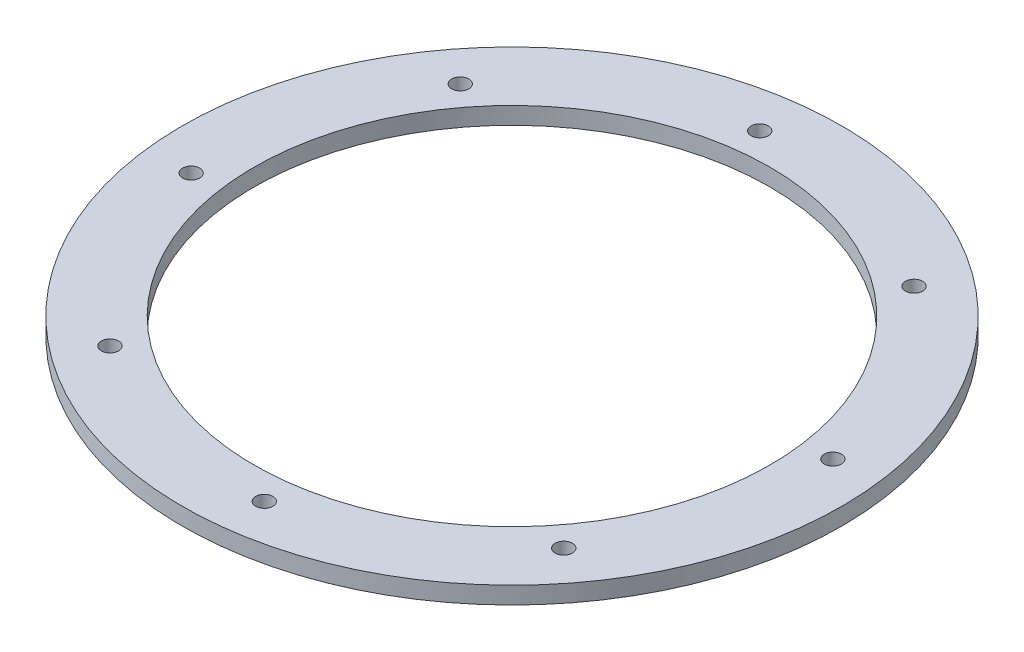
ISO-10303-21;
HEADER;
FILE_DESCRIPTION(('STEP AP214'),'2;1');
FILE_NAME('part.step','',(''),(''),'','','');
FILE_SCHEMA(('AUTOMOTIVE_DESIGN { 1 0 10303 214 1 1 1 1 }'));
ENDSEC;
DATA;
#1=APPLICATION_CONTEXT('core data for automotive mechanical design processes');
#2=APPLICATION_PROTOCOL_DEFINITION('international standard','automotive_design',2000,#1);
#3=PRODUCT_CONTEXT('',#1,'mechanical');
#4=PRODUCT('Part','Part','',(#3));
#5=PRODUCT_RELATED_PRODUCT_CATEGORY('part','',(#4));
#6=PRODUCT_DEFINITION_FORMATION('','',#4);
#7=PRODUCT_DEFINITION_CONTEXT('part definition',#1,'design');
#8=PRODUCT_DEFINITION('design','',#6,#7);
#9=PRODUCT_DEFINITION_SHAPE('','',#8);
#10=(LENGTH_UNIT() NAMED_UNIT(*) SI_UNIT(.MILLI.,.METRE.));
#11=(NAMED_UNIT(*) PLANE_ANGLE_UNIT() SI_UNIT($,.RADIAN.));
#12=(NAMED_UNIT(*) SI_UNIT($,.STERADIAN.) SOLID_ANGLE_UNIT());
#13=UNCERTAINTY_MEASURE_WITH_UNIT(LENGTH_MEASURE(1.E-05),#10,'distance_accuracy_value','');
#14=(GEOMETRIC_REPRESENTATION_CONTEXT(3) GLOBAL_UNCERTAINTY_ASSIGNED_CONTEXT((#13)) GLOBAL_UNIT_ASSIGNED_CONTEXT((#10,
#11,#12)) REPRESENTATION_CONTEXT('',''));
#15=CARTESIAN_POINT('',(0.,0.,0.));
#16=DIRECTION('',(0.,0.,1.));
#17=DIRECTION('',(1.,0.,0.));
#18=AXIS2_PLACEMENT_3D('',#15,#16,#17);
#19=CARTESIAN_POINT('',(0.,-8.,0.));
#20=DIRECTION('',(0.,1.,0.));
#21=DIRECTION('',(-0.791573236897793,0.,-0.611074308596877));
#22=AXIS2_PLACEMENT_3D('',#19,#20,#21);
#23=PLANE('',#22);
#24=CARTESIAN_POINT('',(30.5537154298438,-8.,-39.5786618448896));
#25=DIRECTION('',(0.,1.,0.));
#26=DIRECTION('',(-0.791573236897793,0.,-0.611074308596877));
#27=AXIS2_PLACEMENT_3D('',#24,#25,#26);
#28=CIRCLE('',#27,1.5);
#29=CARTESIAN_POINT('',(29.3663555744972,-8.,-40.495273307785));
#30=VERTEX_POINT('',#29);
#31=EDGE_CURVE('E94',#30,#30,#28,.T.);
#32=ORIENTED_EDGE('',*,*,#31,.F.);
#33=EDGE_LOOP('',(#32));
#34=FACE_BOUND('',#33,.T.);
#35=CARTESIAN_POINT('',(39.5786618448896,-8.,30.5537154298439));
#36=DIRECTION('',(0.,1.,0.));
#37=DIRECTION('',(-0.791573236897793,0.,-0.611074308596877));
#38=AXIS2_PLACEMENT_3D('',#35,#36,#37);
#39=CIRCLE('',#38,1.5);
#40=CARTESIAN_POINT('',(38.391301989543,-8.,29.6371039669485));
#41=VERTEX_POINT('',#40);
#42=EDGE_CURVE('E81',#41,#41,#39,.T.);
#43=ORIENTED_EDGE('',*,*,#42,.F.);
#44=EDGE_LOOP('',(#43));
#45=FACE_BOUND('',#44,.T.);
#46=CARTESIAN_POINT('',(-30.5537154298439,-8.,39.5786618448896));
#47=DIRECTION('',(0.,1.,0.));
#48=DIRECTION('',(-0.791573236897793,0.,-0.611074308596877));
#49=AXIS2_PLACEMENT_3D('',#46,#47,#48);
#50=CIRCLE('',#49,1.5);
#51=CARTESIAN_POINT('',(-31.7410752851905,-8.,38.6620503819943));
#52=VERTEX_POINT('',#51);
#53=EDGE_CURVE('E69',#52,#52,#50,.T.);
#54=ORIENTED_EDGE('',*,*,#53,.F.);
#55=EDGE_LOOP('',(#54));
#56=FACE_BOUND('',#55,.T.);
#57=CARTESIAN_POINT('',(-39.5786618448896,-8.,-30.5537154298438));
#58=DIRECTION('',(0.,1.,0.));
#59=DIRECTION('',(-0.791573236897793,0.,-0.611074308596877));
#60=AXIS2_PLACEMENT_3D('',#57,#58,#59);
#61=CIRCLE('',#60,1.5);
#62=CARTESIAN_POINT('',(-40.7660217002363,-8.,-31.4703268927392));
#63=VERTEX_POINT('',#62);
#64=EDGE_CURVE('E56',#63,#63,#61,.T.);
#65=ORIENTED_EDGE('',*,*,#64,.F.);
#66=EDGE_LOOP('',(#65));
#67=FACE_BOUND('',#66,.T.);
#68=CARTESIAN_POINT('',(0.,-8.,0.));
#69=DIRECTION('',(0.,1.,0.));
#70=DIRECTION('',(-0.791573236897793,0.,-0.611074308596877));
#71=AXIS2_PLACEMENT_3D('',#68,#69,#70);
#72=CIRCLE('',#71,57.5);
#73=CARTESIAN_POINT('',(-45.5154611216231,-8.,-35.1367727443204));
#74=VERTEX_POINT('',#73);
#75=EDGE_CURVE('E10',#74,#74,#72,.T.);
#76=ORIENTED_EDGE('',*,*,#75,.T.);
#77=EDGE_LOOP('',(#76));
#78=FACE_BOUND('',#77,.T.);
#79=CARTESIAN_POINT('',(0.,-8.,0.));
#80=DIRECTION('',(0.,1.,0.));
#81=DIRECTION('',(-0.791573236897793,0.,-0.611074308596877));
#82=AXIS2_PLACEMENT_3D('',#79,#80,#81);
#83=CIRCLE('',#82,45.);
#84=CARTESIAN_POINT('',(-35.6207956604007,-8.,-27.4983438868595));
#85=VERTEX_POINT('',#84);
#86=EDGE_CURVE('E51',#85,#85,#83,.T.);
#87=ORIENTED_EDGE('',*,*,#86,.F.);
#88=EDGE_LOOP('',(#87));
#89=FACE_BOUND('',#88,.T.);
#90=CARTESIAN_POINT('',(-49.5910795516974,-8.,6.3816008099241));
#91=DIRECTION('',(0.,1.,0.));
#92=DIRECTION('',(-0.791573236897793,0.,-0.611074308596877));
#93=AXIS2_PLACEMENT_3D('',#90,#91,#92);
#94=CIRCLE('',#93,1.5);
#95=CARTESIAN_POINT('',(-50.7784394070441,-8.,5.46498934702878));
#96=VERTEX_POINT('',#95);
#97=EDGE_CURVE('E63',#96,#96,#94,.T.);
#98=ORIENTED_EDGE('',*,*,#97,.F.);
#99=EDGE_LOOP('',(#98));
#100=FACE_BOUND('',#99,.T.);
#101=CARTESIAN_POINT('',(6.38160080992409,-8.,49.5910795516974));
#102=DIRECTION('',(0.,1.,0.));
#103=DIRECTION('',(-0.791573236897793,0.,-0.611074308596877));
#104=AXIS2_PLACEMENT_3D('',#101,#102,#103);
#105=CIRCLE('',#104,1.50000000000001);
#106=CARTESIAN_POINT('',(5.1942409545774,-8.,48.674468088802));
#107=VERTEX_POINT('',#106);
#108=EDGE_CURVE('E75',#107,#107,#105,.T.);
#109=ORIENTED_EDGE('',*,*,#108,.F.);
#110=EDGE_LOOP('',(#109));
#111=FACE_BOUND('',#110,.T.);
#112=CARTESIAN_POINT('',(49.5910795516974,-8.,-6.3816008099241));
#113=DIRECTION('',(0.,1.,0.));
#114=DIRECTION('',(-0.791573236897793,0.,-0.611074308596877));
#115=AXIS2_PLACEMENT_3D('',#112,#113,#114);
#116=CIRCLE('',#115,1.5);
#117=CARTESIAN_POINT('',(48.4037196963507,-8.,-7.29821227281942));
#118=VERTEX_POINT('',#117);
#119=EDGE_CURVE('E87',#118,#118,#116,.T.);
#120=ORIENTED_EDGE('',*,*,#119,.F.);
#121=EDGE_LOOP('',(#120));
#122=FACE_BOUND('',#121,.T.);
#123=CARTESIAN_POINT('',(-6.3816008099241,-8.,-49.5910795516974));
#124=DIRECTION('',(0.,1.,0.));
#125=DIRECTION('',(-0.791573236897793,0.,-0.611074308596877));
#126=AXIS2_PLACEMENT_3D('',#123,#124,#125);
#127=CIRCLE('',#126,1.5);
#128=CARTESIAN_POINT('',(-7.56896066527079,-8.,-50.5076910145927));
#129=VERTEX_POINT('',#128);
#130=EDGE_CURVE('E101',#129,#129,#127,.T.);
#131=ORIENTED_EDGE('',*,*,#130,.F.);
#132=EDGE_LOOP('',(#131));
#133=FACE_BOUND('',#132,.T.);
#134=ADVANCED_FACE('F40',(#34,#45,#56,#67,#78,#89,#100,#111,#122,#133),#23,.T.);
#135=CARTESIAN_POINT('',(0.,-11.,0.));
#136=DIRECTION('',(0.,1.,0.));
#137=DIRECTION('',(-0.791573236897793,0.,-0.611074308596877));
#138=AXIS2_PLACEMENT_3D('',#135,#136,#137);
#139=PLANE('',#138);
#140=CARTESIAN_POINT('',(0.,-11.,0.));
#141=DIRECTION('',(0.,1.,0.));
#142=DIRECTION('',(-0.791573236897793,0.,-0.611074308596877));
#143=AXIS2_PLACEMENT_3D('',#140,#141,#142);
#144=CIRCLE('',#143,57.5);
#145=CARTESIAN_POINT('',(-45.5154611216231,-11.,-35.1367727443204));
#146=VERTEX_POINT('',#145);
#147=EDGE_CURVE('E44',#146,#146,#144,.T.);
#148=ORIENTED_EDGE('',*,*,#147,.F.);
#149=EDGE_LOOP('',(#148));
#150=FACE_BOUND('',#149,.T.);
#151=CARTESIAN_POINT('',(0.,-11.,0.));
#152=DIRECTION('',(0.,1.,0.));
#153=DIRECTION('',(-0.791573236897793,0.,-0.611074308596877));
#154=AXIS2_PLACEMENT_3D('',#151,#152,#153);
#155=CIRCLE('',#154,45.);
#156=CARTESIAN_POINT('',(-35.6207956604007,-11.,-27.4983438868595));
#157=VERTEX_POINT('',#156);
#158=EDGE_CURVE('E53',#157,#157,#155,.T.);
#159=ORIENTED_EDGE('',*,*,#158,.T.);
#160=EDGE_LOOP('',(#159));
#161=FACE_BOUND('',#160,.T.);
#162=CARTESIAN_POINT('',(-39.5786618448896,-11.,-30.5537154298438));
#163=DIRECTION('',(0.,1.,0.));
#164=DIRECTION('',(-0.791573236897793,0.,-0.611074308596877));
#165=AXIS2_PLACEMENT_3D('',#162,#163,#164);
#166=CIRCLE('',#165,1.5);
#167=CARTESIAN_POINT('',(-40.7660217002363,-11.,-31.4703268927392));
#168=VERTEX_POINT('',#167);
#169=EDGE_CURVE('E60',#168,#168,#166,.T.);
#170=ORIENTED_EDGE('',*,*,#169,.T.);
#171=EDGE_LOOP('',(#170));
#172=FACE_BOUND('',#171,.T.);
#173=CARTESIAN_POINT('',(-49.5910795516974,-11.,6.3816008099241));
#174=DIRECTION('',(0.,1.,0.));
#175=DIRECTION('',(-0.791573236897793,0.,-0.611074308596877));
#176=AXIS2_PLACEMENT_3D('',#173,#174,#175);
#177=CIRCLE('',#176,1.5);
#178=CARTESIAN_POINT('',(-50.7784394070441,-11.,5.46498934702878));
#179=VERTEX_POINT('',#178);
#180=EDGE_CURVE('E66',#179,#179,#177,.T.);
#181=ORIENTED_EDGE('',*,*,#180,.T.);
#182=EDGE_LOOP('',(#181));
#183=FACE_BOUND('',#182,.T.);
#184=CARTESIAN_POINT('',(-30.5537154298439,-11.,39.5786618448896));
#185=DIRECTION('',(0.,1.,0.));
#186=DIRECTION('',(-0.791573236897793,0.,-0.611074308596877));
#187=AXIS2_PLACEMENT_3D('',#184,#185,#186);
#188=CIRCLE('',#187,1.5);
#189=CARTESIAN_POINT('',(-31.7410752851905,-11.,38.6620503819943));
#190=VERTEX_POINT('',#189);
#191=EDGE_CURVE('E72',#190,#190,#188,.T.);
#192=ORIENTED_EDGE('',*,*,#191,.T.);
#193=EDGE_LOOP('',(#192));
#194=FACE_BOUND('',#193,.T.);
#195=CARTESIAN_POINT('',(6.38160080992409,-11.,49.5910795516974));
#196=DIRECTION('',(0.,1.,0.));
#197=DIRECTION('',(-0.791573236897793,0.,-0.611074308596877));
#198=AXIS2_PLACEMENT_3D('',#195,#196,#197);
#199=CIRCLE('',#198,1.50000000000001);
#200=CARTESIAN_POINT('',(5.1942409545774,-11.,48.674468088802));
#201=VERTEX_POINT('',#200);
#202=EDGE_CURVE('E78',#201,#201,#199,.T.);
#203=ORIENTED_EDGE('',*,*,#202,.T.);
#204=EDGE_LOOP('',(#203));
#205=FACE_BOUND('',#204,.T.);
#206=CARTESIAN_POINT('',(39.5786618448896,-11.,30.5537154298439));
#207=DIRECTION('',(0.,1.,0.));
#208=DIRECTION('',(-0.791573236897793,0.,-0.611074308596877));
#209=AXIS2_PLACEMENT_3D('',#206,#207,#208);
#210=CIRCLE('',#209,1.5);
#211=CARTESIAN_POINT('',(38.391301989543,-11.,29.6371039669485));
#212=VERTEX_POINT('',#211);
#213=EDGE_CURVE('E84',#212,#212,#210,.T.);
#214=ORIENTED_EDGE('',*,*,#213,.T.);
#215=EDGE_LOOP('',(#214));
#216=FACE_BOUND('',#215,.T.);
#217=CARTESIAN_POINT('',(49.5910795516974,-11.,-6.3816008099241));
#218=DIRECTION('',(0.,1.,0.));
#219=DIRECTION('',(-0.791573236897793,0.,-0.611074308596877));
#220=AXIS2_PLACEMENT_3D('',#217,#218,#219);
#221=CIRCLE('',#220,1.5);
#222=CARTESIAN_POINT('',(48.4037196963507,-11.,-7.29821227281942));
#223=VERTEX_POINT('',#222);
#224=EDGE_CURVE('E91',#223,#223,#221,.T.);
#225=ORIENTED_EDGE('',*,*,#224,.T.);
#226=EDGE_LOOP('',(#225));
#227=FACE_BOUND('',#226,.T.);
#228=CARTESIAN_POINT('',(30.5537154298438,-11.,-39.5786618448896));
#229=DIRECTION('',(0.,1.,0.));
#230=DIRECTION('',(-0.791573236897793,0.,-0.611074308596877));
#231=AXIS2_PLACEMENT_3D('',#228,#229,#230);
#232=CIRCLE('',#231,1.5);
#233=CARTESIAN_POINT('',(29.3663555744972,-11.,-40.495273307785));
#234=VERTEX_POINT('',#233);
#235=EDGE_CURVE('E97',#234,#234,#232,.T.);
#236=ORIENTED_EDGE('',*,*,#235,.T.);
#237=EDGE_LOOP('',(#236));
#238=FACE_BOUND('',#237,.T.);
#239=CARTESIAN_POINT('',(-6.3816008099241,-11.,-49.5910795516974));
#240=DIRECTION('',(0.,1.,0.));
#241=DIRECTION('',(-0.791573236897793,0.,-0.611074308596877));
#242=AXIS2_PLACEMENT_3D('',#239,#240,#241);
#243=CIRCLE('',#242,1.5);
#244=CARTESIAN_POINT('',(-7.56896066527079,-11.,-50.5076910145927));
#245=VERTEX_POINT('',#244);
#246=EDGE_CURVE('E105',#245,#245,#243,.T.);
#247=ORIENTED_EDGE('',*,*,#246,.T.);
#248=EDGE_LOOP('',(#247));
#249=FACE_BOUND('',#248,.T.);
#250=ADVANCED_FACE('F115',(#150,#161,#172,#183,#194,#205,#216,#227,#238,#249),#139,.F.);
#251=CARTESIAN_POINT('',(0.,-8.,0.));
#252=DIRECTION('',(0.,-1.,0.));
#253=DIRECTION('',(0.791573236897793,0.,0.611074308596877));
#254=AXIS2_PLACEMENT_3D('',#251,#252,#253);
#255=CYLINDRICAL_SURFACE('',#254,57.5);
#256=ORIENTED_EDGE('',*,*,#75,.F.);
#257=EDGE_LOOP('',(#256));
#258=FACE_BOUND('',#257,.T.);
#259=ORIENTED_EDGE('',*,*,#147,.T.);
#260=EDGE_LOOP('',(#259));
#261=FACE_BOUND('',#260,.T.);
#262=ADVANCED_FACE('F42',(#258,#261),#255,.T.);
#263=CARTESIAN_POINT('',(0.,-8.,0.));
#264=DIRECTION('',(0.,-1.,0.));
#265=DIRECTION('',(0.791573236897793,0.,0.611074308596877));
#266=AXIS2_PLACEMENT_3D('',#263,#264,#265);
#267=CYLINDRICAL_SURFACE('',#266,45.);
#268=ORIENTED_EDGE('',*,*,#86,.T.);
#269=EDGE_LOOP('',(#268));
#270=FACE_BOUND('',#269,.T.);
#271=ORIENTED_EDGE('',*,*,#158,.F.);
#272=EDGE_LOOP('',(#271));
#273=FACE_BOUND('',#272,.T.);
#274=ADVANCED_FACE('F125',(#270,#273),#267,.F.);
#275=CARTESIAN_POINT('',(-39.5786618448896,-8.,-30.5537154298438));
#276=DIRECTION('',(0.,-1.,0.));
#277=DIRECTION('',(0.791573236897793,0.,0.611074308596877));
#278=AXIS2_PLACEMENT_3D('',#275,#276,#277);
#279=CYLINDRICAL_SURFACE('',#278,1.5);
#280=ORIENTED_EDGE('',*,*,#64,.T.);
#281=EDGE_LOOP('',(#280));
#282=FACE_BOUND('',#281,.T.);
#283=ORIENTED_EDGE('',*,*,#169,.F.);
#284=EDGE_LOOP('',(#283));
#285=FACE_BOUND('',#284,.T.);
#286=ADVANCED_FACE('F128',(#282,#285),#279,.F.);
#287=CARTESIAN_POINT('',(-49.5910795516974,-8.,6.3816008099241));
#288=DIRECTION('',(0.,-1.,0.));
#289=DIRECTION('',(0.791573236897793,0.,0.611074308596877));
#290=AXIS2_PLACEMENT_3D('',#287,#288,#289);
#291=CYLINDRICAL_SURFACE('',#290,1.5);
#292=ORIENTED_EDGE('',*,*,#97,.T.);
#293=EDGE_LOOP('',(#292));
#294=FACE_BOUND('',#293,.T.);
#295=ORIENTED_EDGE('',*,*,#180,.F.);
#296=EDGE_LOOP('',(#295));
#297=FACE_BOUND('',#296,.T.);
#298=ADVANCED_FACE('F132',(#294,#297),#291,.F.);
#299=CARTESIAN_POINT('',(-30.5537154298439,-8.,39.5786618448896));
#300=DIRECTION('',(0.,-1.,0.));
#301=DIRECTION('',(0.791573236897793,0.,0.611074308596877));
#302=AXIS2_PLACEMENT_3D('',#299,#300,#301);
#303=CYLINDRICAL_SURFACE('',#302,1.5);
#304=ORIENTED_EDGE('',*,*,#53,.T.);
#305=EDGE_LOOP('',(#304));
#306=FACE_BOUND('',#305,.T.);
#307=ORIENTED_EDGE('',*,*,#191,.F.);
#308=EDGE_LOOP('',(#307));
#309=FACE_BOUND('',#308,.T.);
#310=ADVANCED_FACE('F136',(#306,#309),#303,.F.);
#311=CARTESIAN_POINT('',(6.38160080992409,-8.,49.5910795516974));
#312=DIRECTION('',(0.,-1.,0.));
#313=DIRECTION('',(0.791573236897793,0.,0.611074308596877));
#314=AXIS2_PLACEMENT_3D('',#311,#312,#313);
#315=CYLINDRICAL_SURFACE('',#314,1.50000000000001);
#316=ORIENTED_EDGE('',*,*,#108,.T.);
#317=EDGE_LOOP('',(#316));
#318=FACE_BOUND('',#317,.T.);
#319=ORIENTED_EDGE('',*,*,#202,.F.);
#320=EDGE_LOOP('',(#319));
#321=FACE_BOUND('',#320,.T.);
#322=ADVANCED_FACE('F140',(#318,#321),#315,.F.);
#323=CARTESIAN_POINT('',(39.5786618448896,-8.,30.5537154298439));
#324=DIRECTION('',(0.,-1.,0.));
#325=DIRECTION('',(0.791573236897793,0.,0.611074308596877));
#326=AXIS2_PLACEMENT_3D('',#323,#324,#325);
#327=CYLINDRICAL_SURFACE('',#326,1.5);
#328=ORIENTED_EDGE('',*,*,#42,.T.);
#329=EDGE_LOOP('',(#328));
#330=FACE_BOUND('',#329,.T.);
#331=ORIENTED_EDGE('',*,*,#213,.F.);
#332=EDGE_LOOP('',(#331));
#333=FACE_BOUND('',#332,.T.);
#334=ADVANCED_FACE('F144',(#330,#333),#327,.F.);
#335=CARTESIAN_POINT('',(49.5910795516974,-8.,-6.3816008099241));
#336=DIRECTION('',(0.,-1.,0.));
#337=DIRECTION('',(0.791573236897793,0.,0.611074308596877));
#338=AXIS2_PLACEMENT_3D('',#335,#336,#337);
#339=CYLINDRICAL_SURFACE('',#338,1.5);
#340=ORIENTED_EDGE('',*,*,#119,.T.);
#341=EDGE_LOOP('',(#340));
#342=FACE_BOUND('',#341,.T.);
#343=ORIENTED_EDGE('',*,*,#224,.F.);
#344=EDGE_LOOP('',(#343));
#345=FACE_BOUND('',#344,.T.);
#346=ADVANCED_FACE('F148',(#342,#345),#339,.F.);
#347=CARTESIAN_POINT('',(30.5537154298438,-8.,-39.5786618448896));
#348=DIRECTION('',(0.,-1.,0.));
#349=DIRECTION('',(0.791573236897793,0.,0.611074308596877));
#350=AXIS2_PLACEMENT_3D('',#347,#348,#349);
#351=CYLINDRICAL_SURFACE('',#350,1.5);
#352=ORIENTED_EDGE('',*,*,#31,.T.);
#353=EDGE_LOOP('',(#352));
#354=FACE_BOUND('',#353,.T.);
#355=ORIENTED_EDGE('',*,*,#235,.F.);
#356=EDGE_LOOP('',(#355));
#357=FACE_BOUND('',#356,.T.);
#358=ADVANCED_FACE('F152',(#354,#357),#351,.F.);
#359=CARTESIAN_POINT('',(-6.3816008099241,-8.,-49.5910795516974));
#360=DIRECTION('',(0.,-1.,0.));
#361=DIRECTION('',(0.791573236897793,0.,0.611074308596877));
#362=AXIS2_PLACEMENT_3D('',#359,#360,#361);
#363=CYLINDRICAL_SURFACE('',#362,1.5);
#364=ORIENTED_EDGE('',*,*,#130,.T.);
#365=EDGE_LOOP('',(#364));
#366=FACE_BOUND('',#365,.T.);
#367=ORIENTED_EDGE('',*,*,#246,.F.);
#368=EDGE_LOOP('',(#367));
#369=FACE_BOUND('',#368,.T.);
#370=ADVANCED_FACE('F111',(#366,#369),#363,.F.);
#371=CLOSED_SHELL('',(#134,#250,#262,#274,#286,#298,#310,#322,#334,#346,#358,#370));
#372=MANIFOLD_SOLID_BREP('B2',#371);
#373=ADVANCED_BREP_SHAPE_REPRESENTATION('',(#18,#372),#14);
#374=SHAPE_DEFINITION_REPRESENTATION(#9,#373);
ENDSEC;
END-ISO-10303-21;
